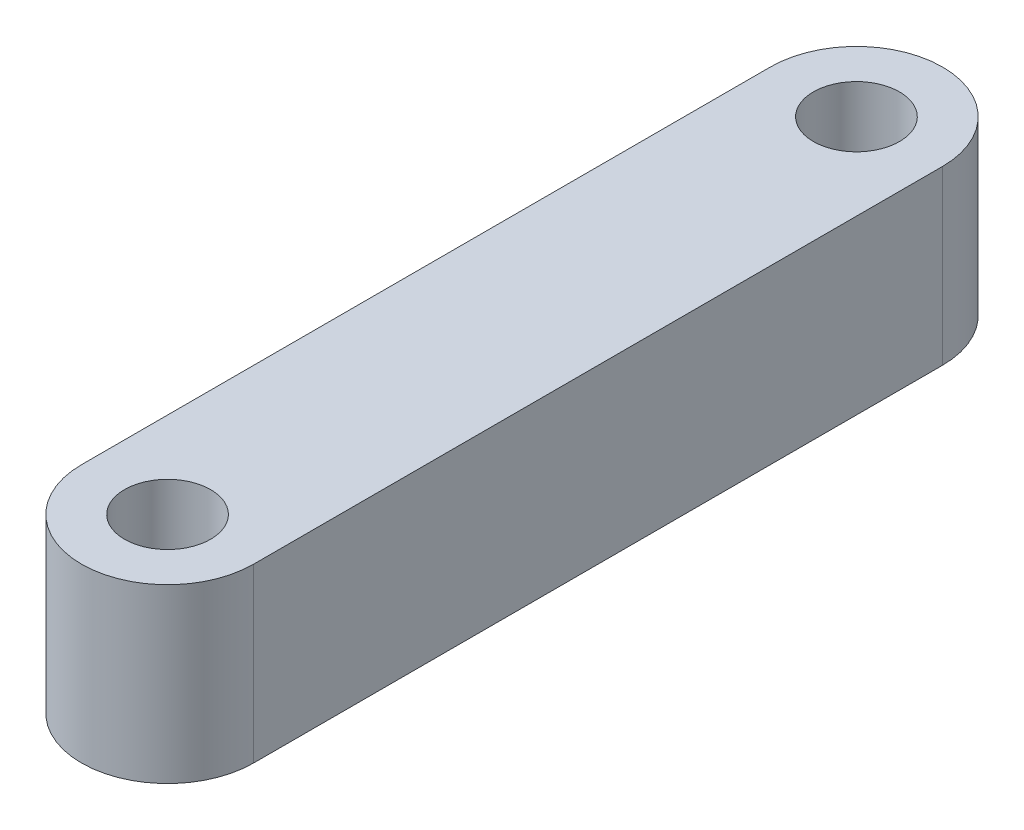
ISO-10303-21;
HEADER;
FILE_DESCRIPTION(('STEP AP214'),'2;1');
FILE_NAME('part.step','',(''),(''),'','','');
FILE_SCHEMA(('AUTOMOTIVE_DESIGN { 1 0 10303 214 1 1 1 1 }'));
ENDSEC;
DATA;
#1=APPLICATION_CONTEXT('core data for automotive mechanical design processes');
#2=APPLICATION_PROTOCOL_DEFINITION('international standard','automotive_design',2000,#1);
#3=PRODUCT_CONTEXT('',#1,'mechanical');
#4=PRODUCT('Part','Part','',(#3));
#5=PRODUCT_RELATED_PRODUCT_CATEGORY('part','',(#4));
#6=PRODUCT_DEFINITION_FORMATION('','',#4);
#7=PRODUCT_DEFINITION_CONTEXT('part definition',#1,'design');
#8=PRODUCT_DEFINITION('design','',#6,#7);
#9=PRODUCT_DEFINITION_SHAPE('','',#8);
#10=(LENGTH_UNIT() NAMED_UNIT(*) SI_UNIT(.MILLI.,.METRE.));
#11=(NAMED_UNIT(*) PLANE_ANGLE_UNIT() SI_UNIT($,.RADIAN.));
#12=(NAMED_UNIT(*) SI_UNIT($,.STERADIAN.) SOLID_ANGLE_UNIT());
#13=UNCERTAINTY_MEASURE_WITH_UNIT(LENGTH_MEASURE(1.E-05),#10,'distance_accuracy_value','');
#14=(GEOMETRIC_REPRESENTATION_CONTEXT(3) GLOBAL_UNCERTAINTY_ASSIGNED_CONTEXT((#13)) GLOBAL_UNIT_ASSIGNED_CONTEXT((#10,
#11,#12)) REPRESENTATION_CONTEXT('',''));
#15=CARTESIAN_POINT('',(0.,0.,0.));
#16=DIRECTION('',(0.,0.,1.));
#17=DIRECTION('',(1.,0.,0.));
#18=AXIS2_PLACEMENT_3D('',#15,#16,#17);
#19=CARTESIAN_POINT('',(0.,6.35,-25.4));
#20=DIRECTION('',(0.,1.,0.));
#21=DIRECTION('',(0.,0.,1.));
#22=AXIS2_PLACEMENT_3D('',#19,#20,#21);
#23=PLANE('',#22);
#24=CARTESIAN_POINT('',(0.,6.35,0.));
#25=DIRECTION('',(0.,1.,0.));
#26=DIRECTION('',(0.,0.,1.));
#27=AXIS2_PLACEMENT_3D('',#24,#25,#26);
#28=CIRCLE('',#27,1.5875);
#29=CARTESIAN_POINT('',(0.,6.35,1.5875));
#30=VERTEX_POINT('',#29);
#31=EDGE_CURVE('E115',#30,#30,#28,.T.);
#32=ORIENTED_EDGE('',*,*,#31,.F.);
#33=EDGE_LOOP('',(#32));
#34=FACE_BOUND('',#33,.T.);
#35=CARTESIAN_POINT('',(0.,6.35,-25.4));
#36=DIRECTION('',(0.,1.,0.));
#37=DIRECTION('',(0.,0.,1.));
#38=AXIS2_PLACEMENT_3D('',#35,#36,#37);
#39=CIRCLE('',#38,3.17500000000001);
#40=CARTESIAN_POINT('',(3.175,6.35,-25.3999997989143));
#41=VERTEX_POINT('',#40);
#42=CARTESIAN_POINT('',(-3.175,6.35,-25.3999997989143));
#43=VERTEX_POINT('',#42);
#44=EDGE_CURVE('E95',#41,#43,#39,.T.);
#45=ORIENTED_EDGE('',*,*,#44,.T.);
#46=DIRECTION('',(0.,0.,1.));
#47=VECTOR('',#46,1.);
#48=CARTESIAN_POINT('',(-3.175,6.35,-25.3999997989143));
#49=LINE('',#48,#47);
#50=CARTESIAN_POINT('',(-3.175,6.35,-2.01078100547619E-07));
#51=VERTEX_POINT('',#50);
#52=EDGE_CURVE('E90',#43,#51,#49,.T.);
#53=ORIENTED_EDGE('',*,*,#52,.T.);
#54=CARTESIAN_POINT('',(0.,6.35,0.));
#55=DIRECTION('',(0.,1.,0.));
#56=DIRECTION('',(0.,0.,1.));
#57=AXIS2_PLACEMENT_3D('',#54,#55,#56);
#58=CIRCLE('',#57,3.17500000000001);
#59=CARTESIAN_POINT('',(3.175,6.35,-2.0107809899904E-07));
#60=VERTEX_POINT('',#59);
#61=EDGE_CURVE('E93',#51,#60,#58,.T.);
#62=ORIENTED_EDGE('',*,*,#61,.T.);
#63=DIRECTION('',(0.,0.,-1.));
#64=VECTOR('',#63,1.);
#65=CARTESIAN_POINT('',(3.175,6.35,-25.3999997989143));
#66=LINE('',#65,#64);
#67=EDGE_CURVE('E60',#60,#41,#66,.T.);
#68=ORIENTED_EDGE('',*,*,#67,.T.);
#69=EDGE_LOOP('',(#45,#53,#62,#68));
#70=FACE_BOUND('',#69,.T.);
#71=CARTESIAN_POINT('',(0.,6.35,-25.4));
#72=DIRECTION('',(0.,1.,0.));
#73=DIRECTION('',(0.,0.,1.));
#74=AXIS2_PLACEMENT_3D('',#71,#72,#73);
#75=CIRCLE('',#74,1.5875);
#76=CARTESIAN_POINT('',(0.,6.35,-23.8125));
#77=VERTEX_POINT('',#76);
#78=EDGE_CURVE('E137',#77,#77,#75,.T.);
#79=ORIENTED_EDGE('',*,*,#78,.F.);
#80=EDGE_LOOP('',(#79));
#81=FACE_BOUND('',#80,.T.);
#82=ADVANCED_FACE('F42',(#34,#70,#81),#23,.T.);
#83=CARTESIAN_POINT('',(0.,0.,-25.4));
#84=DIRECTION('',(0.,1.,0.));
#85=DIRECTION('',(0.,0.,1.));
#86=AXIS2_PLACEMENT_3D('',#83,#84,#85);
#87=PLANE('',#86);
#88=CARTESIAN_POINT('',(0.,0.,-25.4));
#89=DIRECTION('',(0.,1.,0.));
#90=DIRECTION('',(0.,0.,1.));
#91=AXIS2_PLACEMENT_3D('',#88,#89,#90);
#92=CIRCLE('',#91,3.17500000000001);
#93=CARTESIAN_POINT('',(3.175,0.,-25.3999997989143));
#94=VERTEX_POINT('',#93);
#95=CARTESIAN_POINT('',(-3.175,0.,-25.3999997989143));
#96=VERTEX_POINT('',#95);
#97=EDGE_CURVE('E111',#94,#96,#92,.T.);
#98=ORIENTED_EDGE('',*,*,#97,.F.);
#99=DIRECTION('',(0.,0.,-1.));
#100=VECTOR('',#99,1.);
#101=CARTESIAN_POINT('',(3.175,0.,-25.3999997989143));
#102=LINE('',#101,#100);
#103=CARTESIAN_POINT('',(3.175,0.,-2.0107809899904E-07));
#104=VERTEX_POINT('',#103);
#105=EDGE_CURVE('E83',#104,#94,#102,.T.);
#106=ORIENTED_EDGE('',*,*,#105,.F.);
#107=CARTESIAN_POINT('',(0.,0.,0.));
#108=DIRECTION('',(0.,1.,0.));
#109=DIRECTION('',(0.,0.,1.));
#110=AXIS2_PLACEMENT_3D('',#107,#108,#109);
#111=CIRCLE('',#110,3.17500000000001);
#112=CARTESIAN_POINT('',(-3.175,0.,-2.01078100547619E-07));
#113=VERTEX_POINT('',#112);
#114=EDGE_CURVE('E77',#113,#104,#111,.T.);
#115=ORIENTED_EDGE('',*,*,#114,.F.);
#116=DIRECTION('',(0.,0.,1.));
#117=VECTOR('',#116,1.);
#118=CARTESIAN_POINT('',(-3.175,0.,-25.3999997989143));
#119=LINE('',#118,#117);
#120=EDGE_CURVE('E100',#96,#113,#119,.T.);
#121=ORIENTED_EDGE('',*,*,#120,.F.);
#122=EDGE_LOOP('',(#98,#106,#115,#121));
#123=FACE_BOUND('',#122,.T.);
#124=CARTESIAN_POINT('',(0.,0.,0.));
#125=DIRECTION('',(0.,1.,0.));
#126=DIRECTION('',(0.,0.,1.));
#127=AXIS2_PLACEMENT_3D('',#124,#125,#126);
#128=CIRCLE('',#127,1.5875);
#129=CARTESIAN_POINT('',(0.,0.,1.5875));
#130=VERTEX_POINT('',#129);
#131=EDGE_CURVE('E133',#130,#130,#128,.T.);
#132=ORIENTED_EDGE('',*,*,#131,.T.);
#133=EDGE_LOOP('',(#132));
#134=FACE_BOUND('',#133,.T.);
#135=CARTESIAN_POINT('',(0.,0.,-25.4));
#136=DIRECTION('',(0.,1.,0.));
#137=DIRECTION('',(0.,0.,1.));
#138=AXIS2_PLACEMENT_3D('',#135,#136,#137);
#139=CIRCLE('',#138,1.5875);
#140=CARTESIAN_POINT('',(0.,0.,-23.8125));
#141=VERTEX_POINT('',#140);
#142=EDGE_CURVE('E141',#141,#141,#139,.T.);
#143=ORIENTED_EDGE('',*,*,#142,.T.);
#144=EDGE_LOOP('',(#143));
#145=FACE_BOUND('',#144,.T.);
#146=ADVANCED_FACE('F128',(#123,#134,#145),#87,.F.);
#147=CARTESIAN_POINT('',(0.,6.35,-25.4));
#148=DIRECTION('',(0.,-1.,0.));
#149=DIRECTION('',(0.,0.,-1.));
#150=AXIS2_PLACEMENT_3D('',#147,#148,#149);
#151=CYLINDRICAL_SURFACE('',#150,3.17500000000001);
#152=ORIENTED_EDGE('',*,*,#97,.T.);
#153=DIRECTION('',(0.,-1.,0.));
#154=VECTOR('',#153,1.);
#155=CARTESIAN_POINT('',(-3.175,6.35,-25.3999997989143));
#156=LINE('',#155,#154);
#157=EDGE_CURVE('E11',#43,#96,#156,.T.);
#158=ORIENTED_EDGE('',*,*,#157,.F.);
#159=ORIENTED_EDGE('',*,*,#44,.F.);
#160=DIRECTION('',(0.,-1.,0.));
#161=VECTOR('',#160,1.);
#162=CARTESIAN_POINT('',(3.175,6.35,-25.3999997989143));
#163=LINE('',#162,#161);
#164=EDGE_CURVE('E107',#41,#94,#163,.T.);
#165=ORIENTED_EDGE('',*,*,#164,.T.);
#166=EDGE_LOOP('',(#152,#158,#159,#165));
#167=FACE_BOUND('',#166,.T.);
#168=ADVANCED_FACE('F44',(#167),#151,.T.);
#169=CARTESIAN_POINT('',(-3.175,6.35,-25.3999997989143));
#170=DIRECTION('',(1.,0.,0.));
#171=DIRECTION('',(0.,0.,-1.));
#172=AXIS2_PLACEMENT_3D('',#169,#170,#171);
#173=PLANE('',#172);
#174=ORIENTED_EDGE('',*,*,#120,.T.);
#175=DIRECTION('',(0.,-1.,0.));
#176=VECTOR('',#175,1.);
#177=CARTESIAN_POINT('',(-3.175,6.35,-2.01078100547619E-07));
#178=LINE('',#177,#176);
#179=EDGE_CURVE('E52',#51,#113,#178,.T.);
#180=ORIENTED_EDGE('',*,*,#179,.F.);
#181=ORIENTED_EDGE('',*,*,#52,.F.);
#182=ORIENTED_EDGE('',*,*,#157,.T.);
#183=EDGE_LOOP('',(#174,#180,#181,#182));
#184=FACE_BOUND('',#183,.T.);
#185=ADVANCED_FACE('F99',(#184),#173,.F.);
#186=CARTESIAN_POINT('',(0.,6.35,0.));
#187=DIRECTION('',(0.,-1.,0.));
#188=DIRECTION('',(0.,0.,-1.));
#189=AXIS2_PLACEMENT_3D('',#186,#187,#188);
#190=CYLINDRICAL_SURFACE('',#189,3.17500000000001);
#191=ORIENTED_EDGE('',*,*,#114,.T.);
#192=DIRECTION('',(0.,-1.,0.));
#193=VECTOR('',#192,1.);
#194=CARTESIAN_POINT('',(3.175,6.35,-2.0107809899904E-07));
#195=LINE('',#194,#193);
#196=EDGE_CURVE('E102',#60,#104,#195,.T.);
#197=ORIENTED_EDGE('',*,*,#196,.F.);
#198=ORIENTED_EDGE('',*,*,#61,.F.);
#199=ORIENTED_EDGE('',*,*,#179,.T.);
#200=EDGE_LOOP('',(#191,#197,#198,#199));
#201=FACE_BOUND('',#200,.T.);
#202=ADVANCED_FACE('F103',(#201),#190,.T.);
#203=CARTESIAN_POINT('',(3.175,6.35,-25.3999997989143));
#204=DIRECTION('',(-1.,0.,0.));
#205=DIRECTION('',(0.,0.,1.));
#206=AXIS2_PLACEMENT_3D('',#203,#204,#205);
#207=PLANE('',#206);
#208=ORIENTED_EDGE('',*,*,#105,.T.);
#209=ORIENTED_EDGE('',*,*,#164,.F.);
#210=ORIENTED_EDGE('',*,*,#67,.F.);
#211=ORIENTED_EDGE('',*,*,#196,.T.);
#212=EDGE_LOOP('',(#208,#209,#210,#211));
#213=FACE_BOUND('',#212,.T.);
#214=ADVANCED_FACE('F125',(#213),#207,.F.);
#215=CARTESIAN_POINT('',(0.,6.35,0.));
#216=DIRECTION('',(0.,-1.,0.));
#217=DIRECTION('',(0.,0.,-1.));
#218=AXIS2_PLACEMENT_3D('',#215,#216,#217);
#219=CYLINDRICAL_SURFACE('',#218,1.5875);
#220=ORIENTED_EDGE('',*,*,#31,.T.);
#221=EDGE_LOOP('',(#220));
#222=FACE_BOUND('',#221,.T.);
#223=ORIENTED_EDGE('',*,*,#131,.F.);
#224=EDGE_LOOP('',(#223));
#225=FACE_BOUND('',#224,.T.);
#226=ADVANCED_FACE('F160',(#222,#225),#219,.F.);
#227=CARTESIAN_POINT('',(0.,6.35,-25.4));
#228=DIRECTION('',(0.,-1.,0.));
#229=DIRECTION('',(0.,0.,-1.));
#230=AXIS2_PLACEMENT_3D('',#227,#228,#229);
#231=CYLINDRICAL_SURFACE('',#230,1.5875);
#232=ORIENTED_EDGE('',*,*,#78,.T.);
#233=EDGE_LOOP('',(#232));
#234=FACE_BOUND('',#233,.T.);
#235=ORIENTED_EDGE('',*,*,#142,.F.);
#236=EDGE_LOOP('',(#235));
#237=FACE_BOUND('',#236,.T.);
#238=ADVANCED_FACE('F149',(#234,#237),#231,.F.);
#239=CLOSED_SHELL('',(#82,#146,#168,#185,#202,#214,#226,#238));
#240=MANIFOLD_SOLID_BREP('B2',#239);
#241=ADVANCED_BREP_SHAPE_REPRESENTATION('',(#18,#240),#14);
#242=SHAPE_DEFINITION_REPRESENTATION(#9,#241);
ENDSEC;
END-ISO-10303-21;
